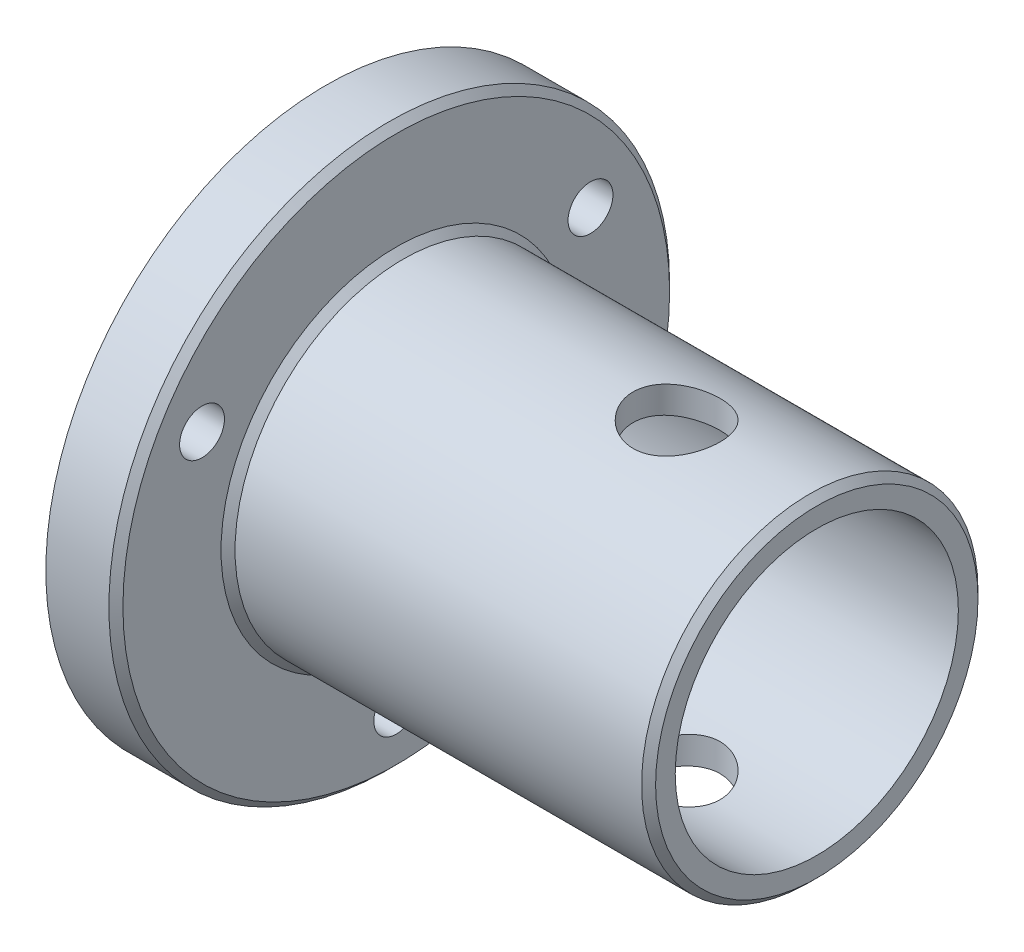
ISO-10303-21;
HEADER;
FILE_DESCRIPTION(('STEP AP214'),'2;1');
FILE_NAME('part.step','',(''),(''),'','','');
FILE_SCHEMA(('AUTOMOTIVE_DESIGN { 1 0 10303 214 1 1 1 1 }'));
ENDSEC;
DATA;
#1=APPLICATION_CONTEXT('core data for automotive mechanical design processes');
#2=APPLICATION_PROTOCOL_DEFINITION('international standard','automotive_design',2000,#1);
#3=PRODUCT_CONTEXT('',#1,'mechanical');
#4=PRODUCT('Part','Part','',(#3));
#5=PRODUCT_RELATED_PRODUCT_CATEGORY('part','',(#4));
#6=PRODUCT_DEFINITION_FORMATION('','',#4);
#7=PRODUCT_DEFINITION_CONTEXT('part definition',#1,'design');
#8=PRODUCT_DEFINITION('design','',#6,#7);
#9=PRODUCT_DEFINITION_SHAPE('','',#8);
#10=(LENGTH_UNIT() NAMED_UNIT(*) SI_UNIT(.MILLI.,.METRE.));
#11=(NAMED_UNIT(*) PLANE_ANGLE_UNIT() SI_UNIT($,.RADIAN.));
#12=(NAMED_UNIT(*) SI_UNIT($,.STERADIAN.) SOLID_ANGLE_UNIT());
#13=UNCERTAINTY_MEASURE_WITH_UNIT(LENGTH_MEASURE(1.E-05),#10,'distance_accuracy_value','');
#14=(GEOMETRIC_REPRESENTATION_CONTEXT(3) GLOBAL_UNCERTAINTY_ASSIGNED_CONTEXT((#13)) GLOBAL_UNIT_ASSIGNED_CONTEXT((#10,
#11,#12)) REPRESENTATION_CONTEXT('',''));
#15=CARTESIAN_POINT('',(0.,0.,0.));
#16=DIRECTION('',(0.,0.,1.));
#17=DIRECTION('',(1.,0.,0.));
#18=AXIS2_PLACEMENT_3D('',#15,#16,#17);
#19=CARTESIAN_POINT('',(35.,0.,0.));
#20=DIRECTION('',(-1.,0.,0.));
#21=DIRECTION('',(0.,0.,1.));
#22=AXIS2_PLACEMENT_3D('',#19,#20,#21);
#23=CYLINDRICAL_SURFACE('',#22,12.);
#24=CARTESIAN_POINT('',(5.50000000000001,0.,0.));
#25=DIRECTION('',(1.,0.,0.));
#26=DIRECTION('',(0.,0.,-1.));
#27=AXIS2_PLACEMENT_3D('',#24,#25,#26);
#28=CIRCLE('',#27,12.);
#29=CARTESIAN_POINT('',(5.50000000000001,0.,-12.));
#30=VERTEX_POINT('',#29);
#31=EDGE_CURVE('E48',#30,#30,#28,.T.);
#32=ORIENTED_EDGE('',*,*,#31,.T.);
#33=EDGE_LOOP('',(#32));
#34=FACE_BOUND('',#33,.T.);
#35=CARTESIAN_POINT('',(34.5,0.,0.));
#36=DIRECTION('',(1.,0.,0.));
#37=DIRECTION('',(0.,0.,-1.));
#38=AXIS2_PLACEMENT_3D('',#35,#36,#37);
#39=CIRCLE('',#38,12.);
#40=CARTESIAN_POINT('',(34.5,0.,-12.));
#41=VERTEX_POINT('',#40);
#42=EDGE_CURVE('E64',#41,#41,#39,.F.);
#43=ORIENTED_EDGE('',*,*,#42,.T.);
#44=EDGE_LOOP('',(#43));
#45=FACE_BOUND('',#44,.T.);
#46=CARTESIAN_POINT('',(25.,-11.5926700979541,-3.1));
#47=CARTESIAN_POINT('',(25.1709812687273,-11.5926732321222,-3.0999954912357));
#48=CARTESIAN_POINT('',(25.3420113313602,-11.5964941540659,-3.08580603872909));
#49=CARTESIAN_POINT('',(25.6791462756398,-11.611322692769,-3.02952201236185));
#50=CARTESIAN_POINT('',(25.8452484356607,-11.6223342063142,-2.9874123075328));
#51=CARTESIAN_POINT('',(26.1676021078596,-11.6502154462981,-2.8767528281645));
#52=CARTESIAN_POINT('',(26.323866564604,-11.6670772760698,-2.80823868019879));
#53=CARTESIAN_POINT('',(26.6227038965771,-11.7047492995837,-2.64682525331377));
#54=CARTESIAN_POINT('',(26.7652759501391,-11.7255597300546,-2.55392451222788));
#55=CARTESIAN_POINT('',(27.0360295916321,-11.7693315191616,-2.34404333029207));
#56=CARTESIAN_POINT('',(27.163842102149,-11.7923291195899,-2.22659423003465));
#57=CARTESIAN_POINT('',(27.3981915312794,-11.8375703908243,-1.97195898842077));
#58=CARTESIAN_POINT('',(27.5047263560674,-11.8598139872542,-1.83477090693754));
#59=CARTESIAN_POINT('',(27.695020595396,-11.9014436748245,-1.54200834198931));
#60=CARTESIAN_POINT('',(27.7784152918266,-11.9207820184585,-1.38618941543748));
#61=CARTESIAN_POINT('',(27.917687075037,-11.954007659976,-1.06216060658955));
#62=CARTESIAN_POINT('',(27.9735685063844,-11.9678958184176,-0.893952685441771));
#63=CARTESIAN_POINT('',(28.0550392473864,-11.9884000367007,-0.553770734206769));
#64=CARTESIAN_POINT('',(28.081255845454,-11.9951664669956,-0.381956155667461));
#65=CARTESIAN_POINT('',(28.1046239856346,-12.001189699885,-0.0362432207716312));
#66=CARTESIAN_POINT('',(28.1017801043448,-12.0004476849492,0.137654803164504));
#67=CARTESIAN_POINT('',(28.0675545353157,-11.9916487016588,0.478240037991099));
#68=CARTESIAN_POINT('',(28.0368502533953,-11.9837653766775,0.645000487656348));
#69=CARTESIAN_POINT('',(27.9488670322867,-11.9617730684823,0.970916767816803));
#70=CARTESIAN_POINT('',(27.8915866268404,-11.9476637417695,1.13007217819233));
#71=CARTESIAN_POINT('',(27.7515433557971,-11.9145431124111,1.43801789833881));
#72=CARTESIAN_POINT('',(27.6685438516611,-11.8954865666526,1.58669552694301));
#73=CARTESIAN_POINT('',(27.4795989672981,-11.8545318437837,1.86824666067749));
#74=CARTESIAN_POINT('',(27.3736493558522,-11.8326331429754,2.00111724451916));
#75=CARTESIAN_POINT('',(27.1381976920348,-11.7876283841855,2.25132438640943));
#76=CARTESIAN_POINT('',(27.0081042125355,-11.7645057211298,2.3681020323851));
#77=CARTESIAN_POINT('',(26.7299394465306,-11.7202333748904,2.57831380162861));
#78=CARTESIAN_POINT('',(26.5818671990644,-11.6990837972746,2.67174667630737));
#79=CARTESIAN_POINT('',(26.270795044652,-11.6610891819864,2.8330075364046));
#80=CARTESIAN_POINT('',(26.1077178096527,-11.6442683584863,2.90069245894728));
#81=CARTESIAN_POINT('',(25.7719576007214,-11.6171413090202,3.00750695874671));
#82=CARTESIAN_POINT('',(25.599276851601,-11.6068335809725,3.04664312037952));
#83=CARTESIAN_POINT('',(25.254416284425,-11.5942174237512,3.09430407740065));
#84=CARTESIAN_POINT('',(25.0823589764788,-11.5916921633405,3.10365887749602));
#85=CARTESIAN_POINT('',(24.7391401147316,-11.5943351499617,3.09377102744816));
#86=CARTESIAN_POINT('',(24.5679784738847,-11.5995026348923,3.07453121010369));
#87=CARTESIAN_POINT('',(24.2345484619628,-11.6167402601914,3.00873001478412));
#88=CARTESIAN_POINT('',(24.0721761697032,-11.6286862698099,2.96265957932974));
#89=CARTESIAN_POINT('',(23.7574610922742,-11.6580153953549,2.84505301580562));
#90=CARTESIAN_POINT('',(23.6051195589164,-11.6753991883511,2.77351371640119));
#91=CARTESIAN_POINT('',(23.3112953954056,-11.7140960291964,2.60528870310117));
#92=CARTESIAN_POINT('',(23.1701043789401,-11.735483254687,2.50811110154685));
#93=CARTESIAN_POINT('',(22.9057284588905,-11.7795988823168,2.2919839065464));
#94=CARTESIAN_POINT('',(22.782546730782,-11.8023275199903,2.1730304818004));
#95=CARTESIAN_POINT('',(22.5542829216208,-11.8473056159507,1.91290429530348));
#96=CARTESIAN_POINT('',(22.4497773110176,-11.86952570636,1.77121961861856));
#97=CARTESIAN_POINT('',(22.2660380700746,-11.9103524913061,1.47183340500616));
#98=CARTESIAN_POINT('',(22.1868031031189,-11.9289593769324,1.31413271578014));
#99=CARTESIAN_POINT('',(22.0565633389923,-11.9603442961819,0.988294681062561));
#100=CARTESIAN_POINT('',(22.0053511266874,-11.9731650294859,0.820244550200718));
#101=CARTESIAN_POINT('',(21.9319975894284,-11.991720545072,0.477545654715656));
#102=CARTESIAN_POINT('',(21.9098502465951,-11.9974567941815,0.302898263761298));
#103=CARTESIAN_POINT('',(21.895612710381,-12.0011325126361,-0.0426369024851989));
#104=CARTESIAN_POINT('',(21.9026743542239,-11.9992920014047,-0.213487900899179));
#105=CARTESIAN_POINT('',(21.9446985165505,-11.9885136629736,-0.551482300379906));
#106=CARTESIAN_POINT('',(21.9796601002656,-11.9795760735567,-0.718625825470205));
#107=CARTESIAN_POINT('',(22.0760243598104,-11.9556466521864,-1.04350746562916));
#108=CARTESIAN_POINT('',(22.1372644025869,-11.9406920931933,-1.20129674565794));
#109=CARTESIAN_POINT('',(22.284301037089,-11.9062979087882,-1.50445044483574));
#110=CARTESIAN_POINT('',(22.3701009020991,-11.8868576856027,-1.64981320444676));
#111=CARTESIAN_POINT('',(22.5663569175467,-11.8449659855827,-1.92797363703745));
#112=CARTESIAN_POINT('',(22.6773821284217,-11.8224507499527,-2.06036019542507));
#113=CARTESIAN_POINT('',(22.9198449996647,-11.7772189294356,-2.30491082042101));
#114=CARTESIAN_POINT('',(23.051287920397,-11.7545022940866,-2.41706965947591));
#115=CARTESIAN_POINT('',(23.3340626625102,-11.7109123351238,-2.62022343696176));
#116=CARTESIAN_POINT('',(23.485743729042,-11.6900857287345,-2.71074311737418));
#117=CARTESIAN_POINT('',(23.8026894353038,-11.653277237802,-2.86486495240525));
#118=CARTESIAN_POINT('',(23.9679445832601,-11.6372920039437,-2.92848572810478));
#119=CARTESIAN_POINT('',(24.2772970390116,-11.614338100382,-3.01809185517792));
#120=CARTESIAN_POINT('',(24.4199805799664,-11.6062759780297,-3.04873795147442));
#121=CARTESIAN_POINT('',(24.7084311240879,-11.5954409014947,-3.0896929427546));
#122=CARTESIAN_POINT('',(24.854197821516,-11.5926674253308,-3.10000384479342));
#123=CARTESIAN_POINT('',(25.,-11.5926700979541,-3.1));
#124=B_SPLINE_CURVE_WITH_KNOTS('',3,(#46,#47,#48,#49,#50,#51,#52,#53,#54,#55,#56,#57,#58,#59,
#60,#61,#62,#63,#64,#65,#66,#67,#68,#69,#70,#71,#72,#73,#74,#75,#76,#77,#78,#79,#80,#81,#82,#83,
#84,#85,#86,#87,#88,#89,#90,#91,#92,#93,#94,#95,#96,#97,#98,#99,#100,#101,#102,#103,#104,#105,
#106,#107,#108,#109,#110,#111,#112,#113,#114,#115,#116,#117,#118,#119,#120,#121,#122,#123),
.UNSPECIFIED.,.T.,.F.,(4,2,2,2,2,2,2,2,2,2,2,2,2,2,2,2,2,2,2,2,2,2,2,2,2,2,2,2,2,2,2,2,2,2,2,2,
2,2,4),(0.,0.512408032707482,1.02509398460181,1.53709059588618,2.0491179123776,2.57199825255387,
3.09493002132231,3.62568797741565,4.15636209562048,4.675591723518,5.19473958166113,
5.70159336892139,6.20847512364484,6.72016653527227,7.2319523658002,7.75850684065091,
8.28508947210651,8.81455663449601,9.34390164398051,9.85835850186142,10.3727643971578,
10.8780410008308,11.3833805426074,11.899226428746,12.4151631616504,12.9449880733492,
13.474784956878,14.000605506698,14.5263171682236,15.0368721362036,15.5474099991034,
16.0548327930151,16.5623232467484,17.0826576071283,17.6031262480937,18.1341484872393,
18.6648025157487,19.1017953096802,19.5387449708773),.UNSPECIFIED.);
#125=CARTESIAN_POINT('',(25.,-11.5926700979541,-3.1));
#126=VERTEX_POINT('',#125);
#127=EDGE_CURVE('E74',#126,#126,#124,.T.);
#128=ORIENTED_EDGE('',*,*,#127,.F.);
#129=EDGE_LOOP('',(#128));
#130=FACE_BOUND('',#129,.T.);
#131=CARTESIAN_POINT('',(25.,11.5926700979541,-3.1));
#132=CARTESIAN_POINT('',(24.8290187312727,11.5926732321222,-3.0999954912357));
#133=CARTESIAN_POINT('',(24.6579886686398,11.5964941540659,-3.08580603872909));
#134=CARTESIAN_POINT('',(24.3208537243602,11.611322692769,-3.02952201236185));
#135=CARTESIAN_POINT('',(24.1547515643393,11.6223342063142,-2.9874123075328));
#136=CARTESIAN_POINT('',(23.8323978921404,11.6502154462981,-2.8767528281645));
#137=CARTESIAN_POINT('',(23.676133435396,11.6670772760698,-2.80823868019879));
#138=CARTESIAN_POINT('',(23.3772961034229,11.7047492995837,-2.64682525331377));
#139=CARTESIAN_POINT('',(23.234724049861,11.7255597300546,-2.55392451222788));
#140=CARTESIAN_POINT('',(22.9639704083679,11.7693315191616,-2.34404333029207));
#141=CARTESIAN_POINT('',(22.836157897851,11.7923291195899,-2.22659423003465));
#142=CARTESIAN_POINT('',(22.6018084687206,11.8375703908244,-1.97195898842076));
#143=CARTESIAN_POINT('',(22.4952736439326,11.8598139872542,-1.83477090693754));
#144=CARTESIAN_POINT('',(22.304979404604,11.9014436748245,-1.54200834198931));
#145=CARTESIAN_POINT('',(22.2215847081734,11.9207820184585,-1.38618941543748));
#146=CARTESIAN_POINT('',(22.082312924963,11.954007659976,-1.06216060658955));
#147=CARTESIAN_POINT('',(22.0264314936156,11.9678958184176,-0.893952685441771));
#148=CARTESIAN_POINT('',(21.9449607526136,11.9884000367007,-0.553770734206769));
#149=CARTESIAN_POINT('',(21.918744154546,11.9951664669956,-0.381956155667461));
#150=CARTESIAN_POINT('',(21.8953760143654,12.001189699885,-0.0362432207716312));
#151=CARTESIAN_POINT('',(21.8982198956552,12.0004476849492,0.137654803164504));
#152=CARTESIAN_POINT('',(21.9324454646843,11.9916487016588,0.478240037991099));
#153=CARTESIAN_POINT('',(21.9631497466047,11.9837653766775,0.645000487656348));
#154=CARTESIAN_POINT('',(22.0511329677133,11.9617730684823,0.970916767816803));
#155=CARTESIAN_POINT('',(22.1084133731596,11.9476637417695,1.13007217819233));
#156=CARTESIAN_POINT('',(22.2484566442029,11.9145431124111,1.43801789833881));
#157=CARTESIAN_POINT('',(22.3314561483389,11.8954865666526,1.58669552694301));
#158=CARTESIAN_POINT('',(22.5204010327019,11.8545318437837,1.86824666067749));
#159=CARTESIAN_POINT('',(22.6263506441478,11.8326331429754,2.00111724451916));
#160=CARTESIAN_POINT('',(22.8618023079652,11.7876283841855,2.25132438640943));
#161=CARTESIAN_POINT('',(22.9918957874645,11.7645057211298,2.3681020323851));
#162=CARTESIAN_POINT('',(23.2700605534694,11.7202333748904,2.57831380162861));
#163=CARTESIAN_POINT('',(23.4181328009356,11.6990837972746,2.67174667630737));
#164=CARTESIAN_POINT('',(23.729204955348,11.6610891819864,2.8330075364046));
#165=CARTESIAN_POINT('',(23.8922821903473,11.6442683584863,2.90069245894728));
#166=CARTESIAN_POINT('',(24.2280423992787,11.6171413090202,3.00750695874672));
#167=CARTESIAN_POINT('',(24.400723148399,11.6068335809725,3.04664312037952));
#168=CARTESIAN_POINT('',(24.745583715575,11.5942174237512,3.09430407740065));
#169=CARTESIAN_POINT('',(24.9176410235212,11.5916921633405,3.10365887749602));
#170=CARTESIAN_POINT('',(25.2608598852684,11.5943351499617,3.09377102744816));
#171=CARTESIAN_POINT('',(25.4320215261153,11.5995026348923,3.07453121010369));
#172=CARTESIAN_POINT('',(25.7654515380372,11.6167402601914,3.00873001478412));
#173=CARTESIAN_POINT('',(25.9278238302968,11.6286862698099,2.96265957932974));
#174=CARTESIAN_POINT('',(26.2425389077258,11.6580153953549,2.84505301580562));
#175=CARTESIAN_POINT('',(26.3948804410836,11.6753991883511,2.77351371640119));
#176=CARTESIAN_POINT('',(26.6887046045944,11.7140960291964,2.60528870310117));
#177=CARTESIAN_POINT('',(26.8298956210599,11.735483254687,2.50811110154685));
#178=CARTESIAN_POINT('',(27.0942715411095,11.7795988823168,2.2919839065464));
#179=CARTESIAN_POINT('',(27.217453269218,11.8023275199903,2.1730304818004));
#180=CARTESIAN_POINT('',(27.4457170783792,11.8473056159507,1.91290429530348));
#181=CARTESIAN_POINT('',(27.5502226889824,11.86952570636,1.77121961861856));
#182=CARTESIAN_POINT('',(27.7339619299254,11.9103524913061,1.47183340500616));
#183=CARTESIAN_POINT('',(27.8131968968811,11.9289593769324,1.31413271578014));
#184=CARTESIAN_POINT('',(27.9434366610077,11.9603442961819,0.98829468106256));
#185=CARTESIAN_POINT('',(27.9946488733126,11.9731650294859,0.820244550200718));
#186=CARTESIAN_POINT('',(28.0680024105716,11.991720545072,0.477545654715656));
#187=CARTESIAN_POINT('',(28.0901497534049,11.9974567941815,0.302898263761298));
#188=CARTESIAN_POINT('',(28.104387289619,12.0011325126361,-0.0426369024851988));
#189=CARTESIAN_POINT('',(28.0973256457761,11.9992920014047,-0.213487900899178));
#190=CARTESIAN_POINT('',(28.0553014834495,11.9885136629736,-0.551482300379906));
#191=CARTESIAN_POINT('',(28.0203398997344,11.9795760735567,-0.718625825470205));
#192=CARTESIAN_POINT('',(27.9239756401896,11.9556466521864,-1.04350746562916));
#193=CARTESIAN_POINT('',(27.8627355974131,11.9406920931933,-1.20129674565794));
#194=CARTESIAN_POINT('',(27.715698962911,11.9062979087882,-1.50445044483574));
#195=CARTESIAN_POINT('',(27.6298990979009,11.8868576856027,-1.64981320444676));
#196=CARTESIAN_POINT('',(27.4336430824533,11.8449659855827,-1.92797363703745));
#197=CARTESIAN_POINT('',(27.3226178715783,11.8224507499527,-2.06036019542507));
#198=CARTESIAN_POINT('',(27.0801550003353,11.7772189294356,-2.30491082042101));
#199=CARTESIAN_POINT('',(26.948712079603,11.7545022940866,-2.41706965947591));
#200=CARTESIAN_POINT('',(26.6659373374898,11.7109123351238,-2.62022343696176));
#201=CARTESIAN_POINT('',(26.514256270958,11.6900857287345,-2.71074311737418));
#202=CARTESIAN_POINT('',(26.1973105646962,11.653277237802,-2.86486495240525));
#203=CARTESIAN_POINT('',(26.0320554167399,11.6372920039437,-2.92848572810478));
#204=CARTESIAN_POINT('',(25.7227029609884,11.614338100382,-3.01809185517792));
#205=CARTESIAN_POINT('',(25.5800194200336,11.6062759780297,-3.04873795147442));
#206=CARTESIAN_POINT('',(25.2915688759121,11.5954409014947,-3.0896929427546));
#207=CARTESIAN_POINT('',(25.145802178484,11.5926674253308,-3.10000384479342));
#208=CARTESIAN_POINT('',(25.,11.5926700979541,-3.1));
#209=B_SPLINE_CURVE_WITH_KNOTS('',3,(#131,#132,#133,#134,#135,#136,#137,#138,#139,#140,#141,
#142,#143,#144,#145,#146,#147,#148,#149,#150,#151,#152,#153,#154,#155,#156,#157,#158,#159,#160,
#161,#162,#163,#164,#165,#166,#167,#168,#169,#170,#171,#172,#173,#174,#175,#176,#177,#178,#179,
#180,#181,#182,#183,#184,#185,#186,#187,#188,#189,#190,#191,#192,#193,#194,#195,#196,#197,#198,
#199,#200,#201,#202,#203,#204,#205,#206,#207,#208),.UNSPECIFIED.,.T.,.F.,(4,2,2,2,2,2,2,2,2,2,2,
2,2,2,2,2,2,2,2,2,2,2,2,2,2,2,2,2,2,2,2,2,2,2,2,2,2,2,4),(0.,0.512408032707482,1.02509398460181,
1.53709059588618,2.0491179123776,2.57199825255387,3.09493002132231,3.62568797741565,
4.15636209562048,4.675591723518,5.19473958166113,5.70159336892139,6.20847512364484,
6.72016653527227,7.2319523658002,7.75850684065091,8.28508947210651,8.81455663449601,
9.34390164398051,9.85835850186142,10.3727643971578,10.8780410008308,11.3833805426074,
11.899226428746,12.4151631616504,12.9449880733492,13.474784956878,14.000605506698,
14.5263171682236,15.0368721362036,15.5474099991034,16.0548327930151,16.5623232467484,
17.0826576071283,17.6031262480937,18.1341484872393,18.6648025157487,19.1017953096802,
19.5387449708773),.UNSPECIFIED.);
#210=CARTESIAN_POINT('',(25.,11.5926700979541,-3.1));
#211=VERTEX_POINT('',#210);
#212=EDGE_CURVE('E106',#211,#211,#209,.T.);
#213=ORIENTED_EDGE('',*,*,#212,.F.);
#214=EDGE_LOOP('',(#213));
#215=FACE_BOUND('',#214,.T.);
#216=ADVANCED_FACE('F39',(#34,#45,#130,#215),#23,.T.);
#217=CARTESIAN_POINT('',(5.,0.,0.));
#218=DIRECTION('',(1.,0.,0.));
#219=DIRECTION('',(0.,0.,-1.));
#220=AXIS2_PLACEMENT_3D('',#217,#218,#219);
#221=CYLINDRICAL_SURFACE('',#220,10.1);
#222=CARTESIAN_POINT('',(5.,0.,0.));
#223=DIRECTION('',(1.,0.,0.));
#224=DIRECTION('',(0.,0.,-1.));
#225=AXIS2_PLACEMENT_3D('',#222,#223,#224);
#226=CIRCLE('',#225,10.1);
#227=CARTESIAN_POINT('',(5.,0.,-10.1));
#228=VERTEX_POINT('',#227);
#229=EDGE_CURVE('E156',#228,#228,#226,.T.);
#230=ORIENTED_EDGE('',*,*,#229,.F.);
#231=EDGE_LOOP('',(#230));
#232=FACE_BOUND('',#231,.T.);
#233=CARTESIAN_POINT('',(35.,0.,0.));
#234=DIRECTION('',(1.,0.,0.));
#235=DIRECTION('',(0.,0.,-1.));
#236=AXIS2_PLACEMENT_3D('',#233,#234,#235);
#237=CIRCLE('',#236,10.1);
#238=CARTESIAN_POINT('',(35.,0.,-10.1));
#239=VERTEX_POINT('',#238);
#240=EDGE_CURVE('E163',#239,#239,#237,.T.);
#241=ORIENTED_EDGE('',*,*,#240,.T.);
#242=EDGE_LOOP('',(#241));
#243=FACE_BOUND('',#242,.T.);
#244=CARTESIAN_POINT('',(25.,-9.61249187255833,-3.1));
#245=CARTESIAN_POINT('',(24.830333374663,-9.6124932552478,-3.09999840509176));
#246=CARTESIAN_POINT('',(24.660650911554,-9.61703311177122,-3.08602359230284));
#247=CARTESIAN_POINT('',(24.3262601243763,-9.63462523821829,-3.03064631551382));
#248=CARTESIAN_POINT('',(24.1615533014811,-9.64768005082844,-2.9892356587238));
#249=CARTESIAN_POINT('',(23.8420044961025,-9.6806872241902,-2.88053593725027));
#250=CARTESIAN_POINT('',(23.6871460636502,-9.70062770515046,-2.81329142118294));
#251=CARTESIAN_POINT('',(23.3908678500441,-9.74514311219198,-2.65498045540085));
#252=CARTESIAN_POINT('',(23.2494502872118,-9.76971880129129,-2.56391008267054));
#253=CARTESIAN_POINT('',(22.9793825833605,-9.8216488033367,-2.35730152153245));
#254=CARTESIAN_POINT('',(22.8512434288671,-9.8490643990638,-2.24111064696241));
#255=CARTESIAN_POINT('',(22.6159286787142,-9.90306279513962,-1.98895688193616));
#256=CARTESIAN_POINT('',(22.5087559039477,-9.92964548302239,-1.85299133520826));
#257=CARTESIAN_POINT('',(22.3161774958724,-9.97968171092584,-1.56149241272757));
#258=CARTESIAN_POINT('',(22.2312957458689,-10.0030546574784,-1.40559788680758));
#259=CARTESIAN_POINT('',(22.0891537917327,-10.0433239051033,-1.08090700031803));
#260=CARTESIAN_POINT('',(22.0318873370358,-10.0602216716178,-0.912113569371551));
#261=CARTESIAN_POINT('',(21.9483008914163,-10.0852029378039,-0.571764611096278));
#262=CARTESIAN_POINT('',(21.9211080567725,-10.0935345203613,-0.400441985885013));
#263=CARTESIAN_POINT('',(21.8956777382889,-10.1013197229664,-0.0554769785519785));
#264=CARTESIAN_POINT('',(21.8974338978477,-10.1007752920038,0.118164885945737));
#265=CARTESIAN_POINT('',(21.9292722629179,-10.091043729752,0.45670502836817));
#266=CARTESIAN_POINT('',(21.9584087128584,-10.0821451721822,0.621701863300298));
#267=CARTESIAN_POINT('',(22.042631883036,-10.0570582365009,0.944339665143941));
#268=CARTESIAN_POINT('',(22.0977202746958,-10.0408693888645,1.10198015755485));
#269=CARTESIAN_POINT('',(22.2329058973434,-10.0026282947733,1.40764222818374));
#270=CARTESIAN_POINT('',(22.3132948158575,-9.98050813101837,1.55552595400346));
#271=CARTESIAN_POINT('',(22.4965670364031,-9.93274208091546,1.83600261211418));
#272=CARTESIAN_POINT('',(22.5994558708387,-9.90709532800695,1.96859177142295));
#273=CARTESIAN_POINT('',(22.8296852286822,-9.85379365565558,2.22035724251267));
#274=CARTESIAN_POINT('',(22.9578435733575,-9.82609945800399,2.33877839703321));
#275=CARTESIAN_POINT('',(23.2324642247719,-9.77272077897073,2.55266774163867));
#276=CARTESIAN_POINT('',(23.3789285292654,-9.74703651743438,2.64813342323166));
#277=CARTESIAN_POINT('',(23.6880715323024,-9.70039228604925,2.81423917740466));
#278=CARTESIAN_POINT('',(23.8509036676267,-9.67948448608689,2.88460941638299));
#279=CARTESIAN_POINT('',(24.1869009321085,-9.64537542916335,2.99669904582599));
#280=CARTESIAN_POINT('',(24.3600624812694,-9.63217151907599,3.03842830077216));
#281=CARTESIAN_POINT('',(24.7045896147441,-9.61555118012018,3.0906149905183));
#282=CARTESIAN_POINT('',(24.8757633435664,-9.61177423215646,3.1022250065609));
#283=CARTESIAN_POINT('',(25.2176217447167,-9.61343631990221,3.09707166548116));
#284=CARTESIAN_POINT('',(25.388306485633,-9.61887399262501,3.08031250460462));
#285=CARTESIAN_POINT('',(25.7194496476712,-9.63799763467111,3.01992499947334));
#286=CARTESIAN_POINT('',(25.8800602772096,-9.65145199075776,2.97705041954541));
#287=CARTESIAN_POINT('',(26.1917934056184,-9.68485007833068,2.8665291615482));
#288=CARTESIAN_POINT('',(26.3429143891022,-9.70479484313219,2.79887853875657));
#289=CARTESIAN_POINT('',(26.6360361287165,-9.74961670587496,2.63857261471551));
#290=CARTESIAN_POINT('',(26.7776655072305,-9.77461573594999,2.54527320298304));
#291=CARTESIAN_POINT('',(27.0436781471963,-9.82647268561803,2.33707589160795));
#292=CARTESIAN_POINT('',(27.1680570730037,-9.85333106999835,2.22217257917877));
#293=CARTESIAN_POINT('',(27.401137787324,-9.90717298125078,1.96859138677206));
#294=CARTESIAN_POINT('',(27.5090194519938,-9.9341190107057,1.82914977530244));
#295=CARTESIAN_POINT('',(27.6998788952078,-9.98402904571212,1.53349472112823));
#296=CARTESIAN_POINT('',(27.782857862146,-10.0069932412606,1.37728207924553));
#297=CARTESIAN_POINT('',(27.9207570307336,-10.0462165485247,1.05351595035434));
#298=CARTESIAN_POINT('',(27.9758837306827,-10.0625248286394,0.88605667684476));
#299=CARTESIAN_POINT('',(28.0570191442867,-10.0868155356776,0.543657600226776));
#300=CARTESIAN_POINT('',(28.0830366166184,-10.0948004669645,0.368720063710141));
#301=CARTESIAN_POINT('',(28.1045238503132,-10.101384905537,0.023892894903192));
#302=CARTESIAN_POINT('',(28.1011803240421,-10.1003490301692,-0.145916722573893));
#303=CARTESIAN_POINT('',(28.0668954612682,-10.089875309691,-0.482447110825083));
#304=CARTESIAN_POINT('',(28.0359558170191,-10.0804379797759,-0.649168070362451));
#305=CARTESIAN_POINT('',(27.9481033147111,-10.0543320220963,-0.972879994282062));
#306=CARTESIAN_POINT('',(27.8914984632651,-10.0377492602037,-1.12996195199546));
#307=CARTESIAN_POINT('',(27.7541992411208,-9.99906442307325,-1.43247779070074));
#308=CARTESIAN_POINT('',(27.6735008124028,-9.97696141817753,-1.57790970426783));
#309=CARTESIAN_POINT('',(27.4872151453641,-9.92864034960449,-1.85822778154843));
#310=CARTESIAN_POINT('',(27.3808930825059,-9.90231037259496,-1.99260614376745));
#311=CARTESIAN_POINT('',(27.147686477934,-9.84884232408972,-2.24200920731052));
#312=CARTESIAN_POINT('',(27.0207958881869,-9.82170401683175,-2.35702819580552));
#313=CARTESIAN_POINT('',(26.7452419059921,-9.76867691190709,-2.56811018653718));
#314=CARTESIAN_POINT('',(26.5960168941091,-9.74285476411868,-2.6634587411745));
#315=CARTESIAN_POINT('',(26.2828944598637,-9.69649014743186,-2.82761305225287));
#316=CARTESIAN_POINT('',(26.1190035202994,-9.67594536116725,-2.89643046557604));
#317=CARTESIAN_POINT('',(25.7973053837338,-9.64430265065523,-3.00001296254446));
#318=CARTESIAN_POINT('',(25.6404103078388,-9.63249027699866,-3.03740107786139));
#319=CARTESIAN_POINT('',(25.3223476064436,-9.61658509897831,-3.08739256796724));
#320=CARTESIAN_POINT('',(25.1611809498086,-9.61249055902244,-3.10000151514079));
#321=CARTESIAN_POINT('',(25.,-9.61249187255833,-3.1));
#322=B_SPLINE_CURVE_WITH_KNOTS('',3,(#244,#245,#246,#247,#248,#249,#250,#251,#252,#253,#254,
#255,#256,#257,#258,#259,#260,#261,#262,#263,#264,#265,#266,#267,#268,#269,#270,#271,#272,#273,
#274,#275,#276,#277,#278,#279,#280,#281,#282,#283,#284,#285,#286,#287,#288,#289,#290,#291,#292,
#293,#294,#295,#296,#297,#298,#299,#300,#301,#302,#303,#304,#305,#306,#307,#308,#309,#310,#311,
#312,#313,#314,#315,#316,#317,#318,#319,#320,#321),.UNSPECIFIED.,.T.,.F.,(4,2,2,2,2,2,2,2,2,2,2,
2,2,2,2,2,2,2,2,2,2,2,2,2,2,2,2,2,2,2,2,2,2,2,2,2,2,2,4),(0.,0.508404853409665,1.0169615932583,
1.52464527198467,2.03241259537663,2.55542937427094,3.07851647342092,3.61297574022779,
4.14731397838657,4.66569993976821,5.18397207581155,5.68497571241129,6.18601162032795,
6.69304968332663,7.20021256011852,7.72779900477272,8.255443076012,8.78860065197135,
9.32157450638728,9.83382989173101,10.3460095130973,10.8440638786379,11.3421975764962,
11.854209025234,12.3663489281225,12.8988550287036,13.4313357132537,13.9598083917145,
14.4881220152082,14.9951836981351,15.5022142890821,16.0033148122098,16.50449978208,
17.0222590777145,17.5401708939933,18.0744602769223,18.6085146429888,19.091600878918,
19.5745784650939),.UNSPECIFIED.);
#323=CARTESIAN_POINT('',(25.,-9.61249187255833,-3.1));
#324=VERTEX_POINT('',#323);
#325=EDGE_CURVE('E75',#324,#324,#322,.T.);
#326=ORIENTED_EDGE('',*,*,#325,.F.);
#327=EDGE_LOOP('',(#326));
#328=FACE_BOUND('',#327,.T.);
#329=CARTESIAN_POINT('',(25.,9.61249187255833,-3.1));
#330=CARTESIAN_POINT('',(25.169666625337,9.6124932552478,-3.09999840509176));
#331=CARTESIAN_POINT('',(25.339349088446,9.61703311177122,-3.08602359230284));
#332=CARTESIAN_POINT('',(25.6737398756237,9.63462523821829,-3.03064631551382));
#333=CARTESIAN_POINT('',(25.8384466985189,9.64768005082844,-2.9892356587238));
#334=CARTESIAN_POINT('',(26.1579955038975,9.6806872241902,-2.88053593725027));
#335=CARTESIAN_POINT('',(26.3128539363498,9.70062770515046,-2.81329142118294));
#336=CARTESIAN_POINT('',(26.6091321499559,9.74514311219199,-2.65498045540085));
#337=CARTESIAN_POINT('',(26.7505497127882,9.7697188012913,-2.56391008267054));
#338=CARTESIAN_POINT('',(27.0206174166395,9.8216488033367,-2.35730152153245));
#339=CARTESIAN_POINT('',(27.1487565711329,9.84906439906379,-2.24111064696241));
#340=CARTESIAN_POINT('',(27.3840713212858,9.90306279513962,-1.98895688193616));
#341=CARTESIAN_POINT('',(27.4912440960523,9.92964548302239,-1.85299133520826));
#342=CARTESIAN_POINT('',(27.6838225041276,9.97968171092585,-1.56149241272757));
#343=CARTESIAN_POINT('',(27.7687042541311,10.0030546574784,-1.40559788680758));
#344=CARTESIAN_POINT('',(27.9108462082673,10.0433239051033,-1.08090700031803));
#345=CARTESIAN_POINT('',(27.9681126629643,10.0602216716178,-0.912113569371552));
#346=CARTESIAN_POINT('',(28.0516991085837,10.0852029378039,-0.571764611096278));
#347=CARTESIAN_POINT('',(28.0788919432275,10.0935345203613,-0.400441985885013));
#348=CARTESIAN_POINT('',(28.1043222617111,10.1013197229664,-0.0554769785519786));
#349=CARTESIAN_POINT('',(28.1025661021523,10.1007752920038,0.118164885945736));
#350=CARTESIAN_POINT('',(28.0707277370821,10.091043729752,0.45670502836817));
#351=CARTESIAN_POINT('',(28.0415912871416,10.0821451721822,0.621701863300298));
#352=CARTESIAN_POINT('',(27.957368116964,10.0570582365009,0.944339665143941));
#353=CARTESIAN_POINT('',(27.9022797253042,10.0408693888645,1.10198015755485));
#354=CARTESIAN_POINT('',(27.7670941026566,10.0026282947733,1.40764222818374));
#355=CARTESIAN_POINT('',(27.6867051841425,9.98050813101837,1.55552595400346));
#356=CARTESIAN_POINT('',(27.5034329635969,9.93274208091546,1.83600261211418));
#357=CARTESIAN_POINT('',(27.4005441291613,9.90709532800695,1.96859177142295));
#358=CARTESIAN_POINT('',(27.1703147713178,9.85379365565558,2.22035724251267));
#359=CARTESIAN_POINT('',(27.0421564266425,9.82609945800399,2.33877839703321));
#360=CARTESIAN_POINT('',(26.7675357752281,9.77272077897073,2.55266774163867));
#361=CARTESIAN_POINT('',(26.6210714707346,9.74703651743438,2.64813342323166));
#362=CARTESIAN_POINT('',(26.3119284676976,9.70039228604925,2.81423917740466));
#363=CARTESIAN_POINT('',(26.1490963323733,9.67948448608689,2.88460941638299));
#364=CARTESIAN_POINT('',(25.8130990678915,9.64537542916335,2.99669904582599));
#365=CARTESIAN_POINT('',(25.6399375187306,9.63217151907599,3.03842830077216));
#366=CARTESIAN_POINT('',(25.2954103852559,9.61555118012018,3.0906149905183));
#367=CARTESIAN_POINT('',(25.1242366564336,9.61177423215646,3.1022250065609));
#368=CARTESIAN_POINT('',(24.7823782552833,9.61343631990221,3.09707166548116));
#369=CARTESIAN_POINT('',(24.611693514367,9.61887399262501,3.08031250460462));
#370=CARTESIAN_POINT('',(24.2805503523288,9.63799763467111,3.01992499947334));
#371=CARTESIAN_POINT('',(24.1199397227904,9.65145199075776,2.97705041954541));
#372=CARTESIAN_POINT('',(23.8082065943816,9.68485007833068,2.8665291615482));
#373=CARTESIAN_POINT('',(23.6570856108978,9.70479484313219,2.79887853875657));
#374=CARTESIAN_POINT('',(23.3639638712835,9.74961670587496,2.63857261471551));
#375=CARTESIAN_POINT('',(23.2223344927695,9.77461573594999,2.54527320298304));
#376=CARTESIAN_POINT('',(22.9563218528037,9.82647268561803,2.33707589160795));
#377=CARTESIAN_POINT('',(22.8319429269963,9.85333106999835,2.22217257917877));
#378=CARTESIAN_POINT('',(22.598862212676,9.90717298125078,1.96859138677206));
#379=CARTESIAN_POINT('',(22.4909805480062,9.9341190107057,1.82914977530244));
#380=CARTESIAN_POINT('',(22.3001211047922,9.98402904571212,1.53349472112823));
#381=CARTESIAN_POINT('',(22.217142137854,10.0069932412606,1.37728207924553));
#382=CARTESIAN_POINT('',(22.0792429692664,10.0462165485247,1.05351595035434));
#383=CARTESIAN_POINT('',(22.0241162693173,10.0625248286394,0.886056676844761));
#384=CARTESIAN_POINT('',(21.9429808557133,10.0868155356776,0.543657600226777));
#385=CARTESIAN_POINT('',(21.9169633833816,10.0948004669645,0.368720063710142));
#386=CARTESIAN_POINT('',(21.8954761496868,10.101384905537,0.0238928949031919));
#387=CARTESIAN_POINT('',(21.8988196759579,10.1003490301692,-0.145916722573893));
#388=CARTESIAN_POINT('',(21.9331045387318,10.089875309691,-0.482447110825083));
#389=CARTESIAN_POINT('',(21.9640441829809,10.0804379797759,-0.649168070362451));
#390=CARTESIAN_POINT('',(22.0518966852889,10.0543320220963,-0.972879994282062));
#391=CARTESIAN_POINT('',(22.1085015367349,10.0377492602037,-1.12996195199546));
#392=CARTESIAN_POINT('',(22.2458007588792,9.99906442307325,-1.43247779070074));
#393=CARTESIAN_POINT('',(22.3264991875972,9.97696141817753,-1.57790970426783));
#394=CARTESIAN_POINT('',(22.5127848546359,9.92864034960449,-1.85822778154843));
#395=CARTESIAN_POINT('',(22.6191069174941,9.90231037259496,-1.99260614376745));
#396=CARTESIAN_POINT('',(22.852313522066,9.84884232408972,-2.24200920731052));
#397=CARTESIAN_POINT('',(22.9792041118131,9.82170401683175,-2.35702819580552));
#398=CARTESIAN_POINT('',(23.2547580940079,9.76867691190709,-2.56811018653718));
#399=CARTESIAN_POINT('',(23.4039831058909,9.74285476411868,-2.6634587411745));
#400=CARTESIAN_POINT('',(23.7171055401363,9.69649014743186,-2.82761305225287));
#401=CARTESIAN_POINT('',(23.8809964797006,9.67594536116725,-2.89643046557604));
#402=CARTESIAN_POINT('',(24.2026946162662,9.64430265065523,-3.00001296254446));
#403=CARTESIAN_POINT('',(24.3595896921612,9.63249027699866,-3.03740107786139));
#404=CARTESIAN_POINT('',(24.6776523935564,9.61658509897831,-3.08739256796724));
#405=CARTESIAN_POINT('',(24.8388190501914,9.61249055902244,-3.10000151514079));
#406=CARTESIAN_POINT('',(25.,9.61249187255833,-3.1));
#407=B_SPLINE_CURVE_WITH_KNOTS('',3,(#329,#330,#331,#332,#333,#334,#335,#336,#337,#338,#339,
#340,#341,#342,#343,#344,#345,#346,#347,#348,#349,#350,#351,#352,#353,#354,#355,#356,#357,#358,
#359,#360,#361,#362,#363,#364,#365,#366,#367,#368,#369,#370,#371,#372,#373,#374,#375,#376,#377,
#378,#379,#380,#381,#382,#383,#384,#385,#386,#387,#388,#389,#390,#391,#392,#393,#394,#395,#396,
#397,#398,#399,#400,#401,#402,#403,#404,#405,#406),.UNSPECIFIED.,.T.,.F.,(4,2,2,2,2,2,2,2,2,2,2,
2,2,2,2,2,2,2,2,2,2,2,2,2,2,2,2,2,2,2,2,2,2,2,2,2,2,2,4),(0.,0.508404853409665,1.0169615932583,
1.52464527198468,2.03241259537663,2.55542937427094,3.07851647342091,3.61297574022779,
4.14731397838657,4.66569993976821,5.18397207581155,5.68497571241128,6.18601162032794,
6.69304968332663,7.20021256011852,7.72779900477272,8.255443076012,8.78860065197135,
9.32157450638728,9.83382989173101,10.3460095130973,10.8440638786379,11.3421975764962,
11.854209025234,12.3663489281225,12.8988550287036,13.4313357132537,13.9598083917145,
14.4881220152082,14.9951836981351,15.5022142890821,16.0033148122098,16.50449978208,
17.0222590777145,17.5401708939933,18.0744602769223,18.6085146429888,19.091600878918,
19.5745784650939),.UNSPECIFIED.);
#408=CARTESIAN_POINT('',(25.,9.61249187255833,-3.1));
#409=VERTEX_POINT('',#408);
#410=EDGE_CURVE('E65',#409,#409,#407,.T.);
#411=ORIENTED_EDGE('',*,*,#410,.F.);
#412=EDGE_LOOP('',(#411));
#413=FACE_BOUND('',#412,.T.);
#414=ADVANCED_FACE('F80',(#232,#243,#328,#413),#221,.F.);
#415=CARTESIAN_POINT('',(5.,0.,0.));
#416=DIRECTION('',(-1.,0.,0.));
#417=DIRECTION('',(0.,0.,1.));
#418=AXIS2_PLACEMENT_3D('',#415,#416,#417);
#419=CYLINDRICAL_SURFACE('',#418,20.);
#420=CARTESIAN_POINT('',(4.5,0.,0.));
#421=DIRECTION('',(1.,0.,0.));
#422=DIRECTION('',(0.,0.,-1.));
#423=AXIS2_PLACEMENT_3D('',#420,#421,#422);
#424=CIRCLE('',#423,20.);
#425=CARTESIAN_POINT('',(4.5,0.,-20.));
#426=VERTEX_POINT('',#425);
#427=EDGE_CURVE('E53',#426,#426,#424,.F.);
#428=ORIENTED_EDGE('',*,*,#427,.T.);
#429=EDGE_LOOP('',(#428));
#430=FACE_BOUND('',#429,.T.);
#431=CARTESIAN_POINT('',(0.,0.,0.));
#432=DIRECTION('',(1.,0.,0.));
#433=DIRECTION('',(0.,0.,-1.));
#434=AXIS2_PLACEMENT_3D('',#431,#432,#433);
#435=CIRCLE('',#434,20.);
#436=CARTESIAN_POINT('',(0.,0.,-20.));
#437=VERTEX_POINT('',#436);
#438=EDGE_CURVE('E152',#437,#437,#435,.T.);
#439=ORIENTED_EDGE('',*,*,#438,.T.);
#440=EDGE_LOOP('',(#439));
#441=FACE_BOUND('',#440,.T.);
#442=ADVANCED_FACE('F122',(#430,#441),#419,.T.);
#443=CARTESIAN_POINT('',(5.,0.,0.));
#444=DIRECTION('',(1.,0.,0.));
#445=DIRECTION('',(0.,0.,-1.));
#446=AXIS2_PLACEMENT_3D('',#443,#444,#445);
#447=PLANE('',#446);
#448=CARTESIAN_POINT('',(5.,8.,-13.856406460551));
#449=DIRECTION('',(1.,0.,0.));
#450=DIRECTION('',(0.,0.,-1.));
#451=AXIS2_PLACEMENT_3D('',#448,#449,#450);
#452=CIRCLE('',#451,1.6);
#453=CARTESIAN_POINT('',(5.,8.,-15.456406460551));
#454=VERTEX_POINT('',#453);
#455=EDGE_CURVE('E107',#454,#454,#452,.T.);
#456=ORIENTED_EDGE('',*,*,#455,.F.);
#457=EDGE_LOOP('',(#456));
#458=FACE_BOUND('',#457,.T.);
#459=CARTESIAN_POINT('',(5.,8.,13.856406460551));
#460=DIRECTION('',(1.,0.,0.));
#461=DIRECTION('',(0.,0.,-1.));
#462=AXIS2_PLACEMENT_3D('',#459,#460,#461);
#463=CIRCLE('',#462,1.6);
#464=CARTESIAN_POINT('',(5.,8.,12.256406460551));
#465=VERTEX_POINT('',#464);
#466=EDGE_CURVE('E189',#465,#465,#463,.T.);
#467=ORIENTED_EDGE('',*,*,#466,.F.);
#468=EDGE_LOOP('',(#467));
#469=FACE_BOUND('',#468,.T.);
#470=CARTESIAN_POINT('',(5.,-16.,0.));
#471=DIRECTION('',(1.,0.,0.));
#472=DIRECTION('',(0.,0.,-1.));
#473=AXIS2_PLACEMENT_3D('',#470,#471,#472);
#474=CIRCLE('',#473,1.59999999999999);
#475=CARTESIAN_POINT('',(5.,-16.,-1.59999999999999));
#476=VERTEX_POINT('',#475);
#477=EDGE_CURVE('E192',#476,#476,#474,.T.);
#478=ORIENTED_EDGE('',*,*,#477,.F.);
#479=EDGE_LOOP('',(#478));
#480=FACE_BOUND('',#479,.T.);
#481=CARTESIAN_POINT('',(5.,0.,0.));
#482=DIRECTION('',(1.,0.,0.));
#483=DIRECTION('',(0.,0.,-1.));
#484=AXIS2_PLACEMENT_3D('',#481,#482,#483);
#485=CIRCLE('',#484,12.5);
#486=CARTESIAN_POINT('',(5.,0.,-12.5));
#487=VERTEX_POINT('',#486);
#488=EDGE_CURVE('E10',#487,#487,#485,.F.);
#489=ORIENTED_EDGE('',*,*,#488,.T.);
#490=EDGE_LOOP('',(#489));
#491=FACE_BOUND('',#490,.T.);
#492=CARTESIAN_POINT('',(5.,0.,0.));
#493=DIRECTION('',(1.,0.,0.));
#494=DIRECTION('',(0.,0.,-1.));
#495=AXIS2_PLACEMENT_3D('',#492,#493,#494);
#496=CIRCLE('',#495,19.5);
#497=CARTESIAN_POINT('',(5.,0.,-19.5));
#498=VERTEX_POINT('',#497);
#499=EDGE_CURVE('E58',#498,#498,#496,.T.);
#500=ORIENTED_EDGE('',*,*,#499,.T.);
#501=EDGE_LOOP('',(#500));
#502=FACE_BOUND('',#501,.T.);
#503=ADVANCED_FACE('F117',(#458,#469,#480,#491,#502),#447,.T.);
#504=CARTESIAN_POINT('',(0.,0.,0.));
#505=DIRECTION('',(1.,0.,0.));
#506=DIRECTION('',(0.,0.,-1.));
#507=AXIS2_PLACEMENT_3D('',#504,#505,#506);
#508=PLANE('',#507);
#509=CARTESIAN_POINT('',(0.,8.,-13.856406460551));
#510=DIRECTION('',(-1.,0.,0.));
#511=DIRECTION('',(0.,0.,1.));
#512=AXIS2_PLACEMENT_3D('',#509,#510,#511);
#513=CIRCLE('',#512,1.6);
#514=CARTESIAN_POINT('',(0.,8.,-12.256406460551));
#515=VERTEX_POINT('',#514);
#516=EDGE_CURVE('E195',#515,#515,#513,.T.);
#517=ORIENTED_EDGE('',*,*,#516,.F.);
#518=EDGE_LOOP('',(#517));
#519=FACE_BOUND('',#518,.T.);
#520=CARTESIAN_POINT('',(0.,8.,13.856406460551));
#521=DIRECTION('',(-1.,0.,0.));
#522=DIRECTION('',(0.,0.,1.));
#523=AXIS2_PLACEMENT_3D('',#520,#521,#522);
#524=CIRCLE('',#523,1.6);
#525=CARTESIAN_POINT('',(0.,8.,15.456406460551));
#526=VERTEX_POINT('',#525);
#527=EDGE_CURVE('E199',#526,#526,#524,.T.);
#528=ORIENTED_EDGE('',*,*,#527,.F.);
#529=EDGE_LOOP('',(#528));
#530=FACE_BOUND('',#529,.T.);
#531=CARTESIAN_POINT('',(0.,-16.,0.));
#532=DIRECTION('',(-1.,0.,0.));
#533=DIRECTION('',(0.,0.,1.));
#534=AXIS2_PLACEMENT_3D('',#531,#532,#533);
#535=CIRCLE('',#534,1.59999999999999);
#536=CARTESIAN_POINT('',(0.,-16.,1.59999999999999));
#537=VERTEX_POINT('',#536);
#538=EDGE_CURVE('E203',#537,#537,#535,.T.);
#539=ORIENTED_EDGE('',*,*,#538,.F.);
#540=EDGE_LOOP('',(#539));
#541=FACE_BOUND('',#540,.T.);
#542=ORIENTED_EDGE('',*,*,#438,.F.);
#543=EDGE_LOOP('',(#542));
#544=FACE_BOUND('',#543,.T.);
#545=ADVANCED_FACE('F121',(#519,#530,#541,#544),#508,.F.);
#546=CARTESIAN_POINT('',(35.,0.,0.));
#547=DIRECTION('',(1.,0.,0.));
#548=DIRECTION('',(0.,0.,-1.));
#549=AXIS2_PLACEMENT_3D('',#546,#547,#548);
#550=PLANE('',#549);
#551=CARTESIAN_POINT('',(35.,0.,0.));
#552=DIRECTION('',(1.,0.,0.));
#553=DIRECTION('',(0.,0.,-1.));
#554=AXIS2_PLACEMENT_3D('',#551,#552,#553);
#555=CIRCLE('',#554,11.5);
#556=CARTESIAN_POINT('',(35.,0.,-11.5));
#557=VERTEX_POINT('',#556);
#558=EDGE_CURVE('E155',#557,#557,#555,.T.);
#559=ORIENTED_EDGE('',*,*,#558,.T.);
#560=EDGE_LOOP('',(#559));
#561=FACE_BOUND('',#560,.T.);
#562=ORIENTED_EDGE('',*,*,#240,.F.);
#563=EDGE_LOOP('',(#562));
#564=FACE_BOUND('',#563,.T.);
#565=ADVANCED_FACE('F116',(#561,#564),#550,.T.);
#566=CARTESIAN_POINT('',(5.,0.,0.));
#567=DIRECTION('',(1.,0.,0.));
#568=DIRECTION('',(0.,0.,-1.));
#569=AXIS2_PLACEMENT_3D('',#566,#567,#568);
#570=PLANE('',#569);
#571=ORIENTED_EDGE('',*,*,#229,.T.);
#572=EDGE_LOOP('',(#571));
#573=FACE_BOUND('',#572,.T.);
#574=ADVANCED_FACE('F93',(#573),#570,.T.);
#575=CARTESIAN_POINT('',(35.,0.,0.));
#576=DIRECTION('',(-1.,0.,0.));
#577=DIRECTION('',(0.,0.,1.));
#578=AXIS2_PLACEMENT_3D('',#575,#576,#577);
#579=CONICAL_SURFACE('',#578,11.5,0.78539816339744);
#580=ORIENTED_EDGE('',*,*,#42,.F.);
#581=EDGE_LOOP('',(#580));
#582=FACE_BOUND('',#581,.T.);
#583=ORIENTED_EDGE('',*,*,#558,.F.);
#584=EDGE_LOOP('',(#583));
#585=FACE_BOUND('',#584,.T.);
#586=ADVANCED_FACE('F131',(#582,#585),#579,.T.);
#587=CARTESIAN_POINT('',(25.,20.,0.));
#588=DIRECTION('',(0.,-1.,0.));
#589=DIRECTION('',(0.,0.,-1.));
#590=AXIS2_PLACEMENT_3D('',#587,#588,#589);
#591=CYLINDRICAL_SURFACE('',#590,3.1);
#592=ORIENTED_EDGE('',*,*,#325,.T.);
#593=EDGE_LOOP('',(#592));
#594=FACE_BOUND('',#593,.T.);
#595=ORIENTED_EDGE('',*,*,#127,.T.);
#596=EDGE_LOOP('',(#595));
#597=FACE_BOUND('',#596,.T.);
#598=ADVANCED_FACE('F89',(#594,#597),#591,.F.);
#599=ORIENTED_EDGE('',*,*,#410,.T.);
#600=EDGE_LOOP('',(#599));
#601=FACE_BOUND('',#600,.T.);
#602=ORIENTED_EDGE('',*,*,#212,.T.);
#603=EDGE_LOOP('',(#602));
#604=FACE_BOUND('',#603,.T.);
#605=ADVANCED_FACE('F84',(#601,#604),#591,.F.);
#606=CARTESIAN_POINT('',(5.,0.,0.));
#607=DIRECTION('',(-1.,0.,0.));
#608=DIRECTION('',(0.,0.,1.));
#609=AXIS2_PLACEMENT_3D('',#606,#607,#608);
#610=CONICAL_SURFACE('',#609,19.5,0.785398163397441);
#611=ORIENTED_EDGE('',*,*,#427,.F.);
#612=EDGE_LOOP('',(#611));
#613=FACE_BOUND('',#612,.T.);
#614=ORIENTED_EDGE('',*,*,#499,.F.);
#615=EDGE_LOOP('',(#614));
#616=FACE_BOUND('',#615,.T.);
#617=ADVANCED_FACE('F88',(#613,#616),#610,.T.);
#618=CARTESIAN_POINT('',(5.50000000000001,0.,0.));
#619=DIRECTION('',(-1.,0.,0.));
#620=DIRECTION('',(0.,0.,1.));
#621=AXIS2_PLACEMENT_3D('',#618,#619,#620);
#622=CONICAL_SURFACE('',#621,12.,0.785398163397447);
#623=ORIENTED_EDGE('',*,*,#488,.F.);
#624=EDGE_LOOP('',(#623));
#625=FACE_BOUND('',#624,.T.);
#626=ORIENTED_EDGE('',*,*,#31,.F.);
#627=EDGE_LOOP('',(#626));
#628=FACE_BOUND('',#627,.T.);
#629=ADVANCED_FACE('F42',(#625,#628),#622,.T.);
#630=CARTESIAN_POINT('',(10.,-16.,0.));
#631=DIRECTION('',(-1.,0.,0.));
#632=DIRECTION('',(0.,0.,1.));
#633=AXIS2_PLACEMENT_3D('',#630,#631,#632);
#634=CYLINDRICAL_SURFACE('',#633,1.59999999999999);
#635=ORIENTED_EDGE('',*,*,#477,.T.);
#636=EDGE_LOOP('',(#635));
#637=FACE_BOUND('',#636,.T.);
#638=ORIENTED_EDGE('',*,*,#538,.T.);
#639=EDGE_LOOP('',(#638));
#640=FACE_BOUND('',#639,.T.);
#641=ADVANCED_FACE('F91',(#637,#640),#634,.F.);
#642=CARTESIAN_POINT('',(10.,8.,13.856406460551));
#643=DIRECTION('',(-1.,0.,0.));
#644=DIRECTION('',(0.,0.,1.));
#645=AXIS2_PLACEMENT_3D('',#642,#643,#644);
#646=CYLINDRICAL_SURFACE('',#645,1.6);
#647=ORIENTED_EDGE('',*,*,#466,.T.);
#648=EDGE_LOOP('',(#647));
#649=FACE_BOUND('',#648,.T.);
#650=ORIENTED_EDGE('',*,*,#527,.T.);
#651=EDGE_LOOP('',(#650));
#652=FACE_BOUND('',#651,.T.);
#653=ADVANCED_FACE('F211',(#649,#652),#646,.F.);
#654=CARTESIAN_POINT('',(10.,8.,-13.856406460551));
#655=DIRECTION('',(-1.,0.,0.));
#656=DIRECTION('',(0.,0.,1.));
#657=AXIS2_PLACEMENT_3D('',#654,#655,#656);
#658=CYLINDRICAL_SURFACE('',#657,1.6);
#659=ORIENTED_EDGE('',*,*,#455,.T.);
#660=EDGE_LOOP('',(#659));
#661=FACE_BOUND('',#660,.T.);
#662=ORIENTED_EDGE('',*,*,#516,.T.);
#663=EDGE_LOOP('',(#662));
#664=FACE_BOUND('',#663,.T.);
#665=ADVANCED_FACE('F216',(#661,#664),#658,.F.);
#666=CLOSED_SHELL('',(#216,#414,#442,#503,#545,#565,#574,#586,#598,#605,#617,#629,#641,#653,#665));
#667=MANIFOLD_SOLID_BREP('B2',#666);
#668=ADVANCED_BREP_SHAPE_REPRESENTATION('',(#18,#667),#14);
#669=SHAPE_DEFINITION_REPRESENTATION(#9,#668);
ENDSEC;
END-ISO-10303-21;
